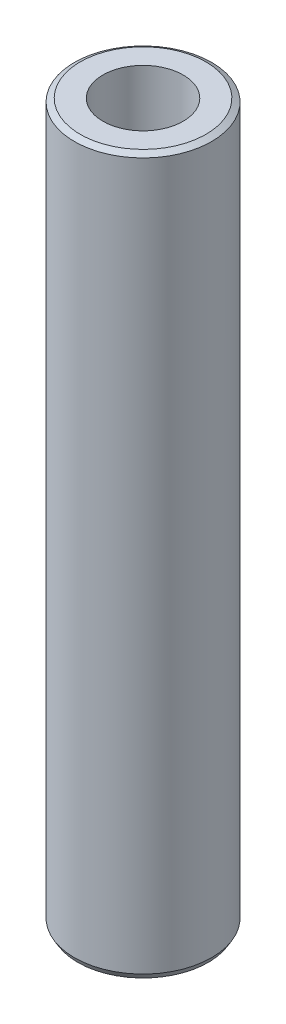
ISO-10303-21;
HEADER;
FILE_DESCRIPTION(('STEP AP214'),'2;1');
FILE_NAME('part.step','',(''),(''),'','','');
FILE_SCHEMA(('AUTOMOTIVE_DESIGN { 1 0 10303 214 1 1 1 1 }'));
ENDSEC;
DATA;
#1=APPLICATION_CONTEXT('core data for automotive mechanical design processes');
#2=APPLICATION_PROTOCOL_DEFINITION('international standard','automotive_design',2000,#1);
#3=PRODUCT_CONTEXT('',#1,'mechanical');
#4=PRODUCT('Part','Part','',(#3));
#5=PRODUCT_RELATED_PRODUCT_CATEGORY('part','',(#4));
#6=PRODUCT_DEFINITION_FORMATION('','',#4);
#7=PRODUCT_DEFINITION_CONTEXT('part definition',#1,'design');
#8=PRODUCT_DEFINITION('design','',#6,#7);
#9=PRODUCT_DEFINITION_SHAPE('','',#8);
#10=(LENGTH_UNIT() NAMED_UNIT(*) SI_UNIT(.MILLI.,.METRE.));
#11=(NAMED_UNIT(*) PLANE_ANGLE_UNIT() SI_UNIT($,.RADIAN.));
#12=(NAMED_UNIT(*) SI_UNIT($,.STERADIAN.) SOLID_ANGLE_UNIT());
#13=UNCERTAINTY_MEASURE_WITH_UNIT(LENGTH_MEASURE(1.E-05),#10,'distance_accuracy_value','');
#14=(GEOMETRIC_REPRESENTATION_CONTEXT(3) GLOBAL_UNCERTAINTY_ASSIGNED_CONTEXT((#13)) GLOBAL_UNIT_ASSIGNED_CONTEXT((#10,
#11,#12)) REPRESENTATION_CONTEXT('',''));
#15=CARTESIAN_POINT('',(0.,0.,0.));
#16=DIRECTION('',(0.,0.,1.));
#17=DIRECTION('',(1.,0.,0.));
#18=AXIS2_PLACEMENT_3D('',#15,#16,#17);
#19=CARTESIAN_POINT('',(0.,600.,0.));
#20=DIRECTION('',(0.,-1.,0.));
#21=DIRECTION('',(0.,0.,-1.));
#22=AXIS2_PLACEMENT_3D('',#19,#20,#21);
#23=CYLINDRICAL_SURFACE('',#22,57.5);
#24=CARTESIAN_POINT('',(0.,597.20780532092,0.));
#25=DIRECTION('',(0.,1.,0.));
#26=DIRECTION('',(0.,0.,1.));
#27=AXIS2_PLACEMENT_3D('',#24,#25,#26);
#28=CIRCLE('',#27,57.5);
#29=CARTESIAN_POINT('',(0.,597.207805320919,-57.5000000000001));
#30=VERTEX_POINT('',#29);
#31=EDGE_CURVE('E50',#30,#30,#28,.F.);
#32=ORIENTED_EDGE('',*,*,#31,.T.);
#33=EDGE_LOOP('',(#32));
#34=FACE_BOUND('',#33,.T.);
#35=CARTESIAN_POINT('',(0.,4.83622304879094,0.));
#36=DIRECTION('',(0.,1.,0.));
#37=DIRECTION('',(0.,0.,1.));
#38=AXIS2_PLACEMENT_3D('',#35,#36,#37);
#39=CIRCLE('',#38,57.5);
#40=CARTESIAN_POINT('',(0.,4.83622304879094,57.5));
#41=VERTEX_POINT('',#40);
#42=EDGE_CURVE('E51',#41,#41,#39,.T.);
#43=ORIENTED_EDGE('',*,*,#42,.T.);
#44=EDGE_LOOP('',(#43));
#45=FACE_BOUND('',#44,.T.);
#46=ADVANCED_FACE('F39',(#34,#45),#23,.T.);
#47=CARTESIAN_POINT('',(0.,600.,0.));
#48=DIRECTION('',(0.,1.,0.));
#49=DIRECTION('',(0.,0.,1.));
#50=AXIS2_PLACEMENT_3D('',#47,#48,#49);
#51=PLANE('',#50);
#52=CARTESIAN_POINT('',(0.,600.,0.));
#53=DIRECTION('',(0.,1.,0.));
#54=DIRECTION('',(0.,0.,1.));
#55=AXIS2_PLACEMENT_3D('',#52,#53,#54);
#56=CIRCLE('',#55,52.6637769512092);
#57=CARTESIAN_POINT('',(0.,600.,-52.6637769512093));
#58=VERTEX_POINT('',#57);
#59=EDGE_CURVE('E54',#58,#58,#56,.T.);
#60=ORIENTED_EDGE('',*,*,#59,.T.);
#61=EDGE_LOOP('',(#60));
#62=FACE_BOUND('',#61,.T.);
#63=CARTESIAN_POINT('',(0.,600.,0.));
#64=DIRECTION('',(0.,1.,0.));
#65=DIRECTION('',(0.,0.,1.));
#66=AXIS2_PLACEMENT_3D('',#63,#64,#65);
#67=CIRCLE('',#66,33.6478027003522);
#68=CARTESIAN_POINT('',(0.,600.,33.6478027003522));
#69=VERTEX_POINT('',#68);
#70=EDGE_CURVE('E58',#69,#69,#67,.T.);
#71=ORIENTED_EDGE('',*,*,#70,.F.);
#72=EDGE_LOOP('',(#71));
#73=FACE_BOUND('',#72,.T.);
#74=ADVANCED_FACE('F69',(#62,#73),#51,.T.);
#75=CARTESIAN_POINT('',(0.,0.,0.));
#76=DIRECTION('',(0.,1.,0.));
#77=DIRECTION('',(0.,0.,1.));
#78=AXIS2_PLACEMENT_3D('',#75,#76,#77);
#79=PLANE('',#78);
#80=CARTESIAN_POINT('',(0.,0.,0.));
#81=DIRECTION('',(0.,1.,0.));
#82=DIRECTION('',(0.,0.,1.));
#83=AXIS2_PLACEMENT_3D('',#80,#81,#82);
#84=CIRCLE('',#83,54.7078053209195);
#85=CARTESIAN_POINT('',(0.,0.,54.7078053209195));
#86=VERTEX_POINT('',#85);
#87=EDGE_CURVE('E10',#86,#86,#84,.F.);
#88=ORIENTED_EDGE('',*,*,#87,.T.);
#89=EDGE_LOOP('',(#88));
#90=FACE_BOUND('',#89,.T.);
#91=CARTESIAN_POINT('',(0.,0.,0.));
#92=DIRECTION('',(0.,1.,0.));
#93=DIRECTION('',(0.,0.,1.));
#94=AXIS2_PLACEMENT_3D('',#91,#92,#93);
#95=CIRCLE('',#94,33.6478027003522);
#96=CARTESIAN_POINT('',(0.,0.,33.6478027003522));
#97=VERTEX_POINT('',#96);
#98=EDGE_CURVE('E63',#97,#97,#95,.T.);
#99=ORIENTED_EDGE('',*,*,#98,.T.);
#100=EDGE_LOOP('',(#99));
#101=FACE_BOUND('',#100,.T.);
#102=ADVANCED_FACE('F75',(#90,#101),#79,.F.);
#103=CARTESIAN_POINT('',(0.,600.,0.));
#104=DIRECTION('',(0.,-1.,0.));
#105=DIRECTION('',(0.,0.,-1.));
#106=AXIS2_PLACEMENT_3D('',#103,#104,#105);
#107=CYLINDRICAL_SURFACE('',#106,33.6478027003522);
#108=ORIENTED_EDGE('',*,*,#70,.T.);
#109=EDGE_LOOP('',(#108));
#110=FACE_BOUND('',#109,.T.);
#111=ORIENTED_EDGE('',*,*,#98,.F.);
#112=EDGE_LOOP('',(#111));
#113=FACE_BOUND('',#112,.T.);
#114=ADVANCED_FACE('F70',(#110,#113),#107,.F.);
#115=CARTESIAN_POINT('',(0.,600.,0.));
#116=DIRECTION('',(0.,-1.,0.));
#117=DIRECTION('',(0.,0.,-1.));
#118=AXIS2_PLACEMENT_3D('',#115,#116,#117);
#119=CONICAL_SURFACE('',#118,52.6637769512092,1.0471975511966);
#120=CARTESIAN_POINT('',(0.,597.207805320919,-57.5000000000001));
#121=CARTESIAN_POINT('',(0.,597.23689068216,-57.4496226765752));
#122=CARTESIAN_POINT('',(0.,597.2659760434,-57.3992453531503));
#123=CARTESIAN_POINT('',(0.,597.324146765881,-57.2984907063005));
#124=CARTESIAN_POINT('',(0.,597.353232127122,-57.2481133828756));
#125=CARTESIAN_POINT('',(0.,597.411402849602,-57.1473587360258));
#126=CARTESIAN_POINT('',(0.,597.440488210843,-57.0969814126009));
#127=CARTESIAN_POINT('',(0.,597.498658933324,-56.9962267657511));
#128=CARTESIAN_POINT('',(0.,597.527744294564,-56.9458494423262));
#129=CARTESIAN_POINT('',(0.,597.585915017045,-56.8450947954763));
#130=CARTESIAN_POINT('',(0.,597.615000378285,-56.7947174720514));
#131=CARTESIAN_POINT('',(0.,597.673171100766,-56.6939628252016));
#132=CARTESIAN_POINT('',(0.,597.702256462007,-56.6435855017767));
#133=CARTESIAN_POINT('',(0.,597.760427184488,-56.5428308549269));
#134=CARTESIAN_POINT('',(0.,597.789512545728,-56.492453531502));
#135=CARTESIAN_POINT('',(0.,597.847683268209,-56.3916988846522));
#136=CARTESIAN_POINT('',(0.,597.876768629449,-56.3413215612273));
#137=CARTESIAN_POINT('',(0.,597.93493935193,-56.2405669143775));
#138=CARTESIAN_POINT('',(0.,597.96402471317,-56.1901895909526));
#139=CARTESIAN_POINT('',(0.,598.022195435651,-56.0894349441028));
#140=CARTESIAN_POINT('',(0.,598.051280796892,-56.0390576206779));
#141=CARTESIAN_POINT('',(0.,598.109451519373,-55.9383029738281));
#142=CARTESIAN_POINT('',(0.,598.138536880613,-55.8879256504032));
#143=CARTESIAN_POINT('',(0.,598.196707603094,-55.7871710035533));
#144=CARTESIAN_POINT('',(0.,598.225792964334,-55.7367936801284));
#145=CARTESIAN_POINT('',(0.,598.283963686815,-55.6360390332786));
#146=CARTESIAN_POINT('',(0.,598.313049048056,-55.5856617098537));
#147=CARTESIAN_POINT('',(0.,598.371219770536,-55.4849070630039));
#148=CARTESIAN_POINT('',(0.,598.400305131777,-55.434529739579));
#149=CARTESIAN_POINT('',(0.,598.458475854258,-55.3337750927292));
#150=CARTESIAN_POINT('',(0.,598.487561215498,-55.2833977693043));
#151=CARTESIAN_POINT('',(0.,598.545731937979,-55.1826431224545));
#152=CARTESIAN_POINT('',(0.,598.574817299219,-55.1322657990296));
#153=CARTESIAN_POINT('',(0.,598.6329880217,-55.0315111521798));
#154=CARTESIAN_POINT('',(0.,598.662073382941,-54.9811338287549));
#155=CARTESIAN_POINT('',(0.,598.720244105421,-54.8803791819051));
#156=CARTESIAN_POINT('',(0.,598.749329466662,-54.8300018584802));
#157=CARTESIAN_POINT('',(0.,598.807500189143,-54.7292472116303));
#158=CARTESIAN_POINT('',(0.,598.836585550383,-54.6788698882054));
#159=CARTESIAN_POINT('',(0.,598.894756272864,-54.5781152413556));
#160=CARTESIAN_POINT('',(0.,598.923841634104,-54.5277379179307));
#161=CARTESIAN_POINT('',(0.,598.982012356585,-54.4269832710809));
#162=CARTESIAN_POINT('',(0.,599.011097717826,-54.376605947656));
#163=CARTESIAN_POINT('',(0.,599.069268440306,-54.2758513008062));
#164=CARTESIAN_POINT('',(0.,599.098353801547,-54.2254739773813));
#165=CARTESIAN_POINT('',(0.,599.156524524028,-54.1247193305315));
#166=CARTESIAN_POINT('',(0.,599.185609885268,-54.0743420071066));
#167=CARTESIAN_POINT('',(0.,599.243780607749,-53.9735873602568));
#168=CARTESIAN_POINT('',(0.,599.272865968989,-53.9232100368319));
#169=CARTESIAN_POINT('',(0.,599.33103669147,-53.8224553899821));
#170=CARTESIAN_POINT('',(0.,599.360122052711,-53.7720780665572));
#171=CARTESIAN_POINT('',(0.,599.418292775192,-53.6713234197073));
#172=CARTESIAN_POINT('',(0.,599.447378136432,-53.6209460962824));
#173=CARTESIAN_POINT('',(0.,599.505548858913,-53.5201914494326));
#174=CARTESIAN_POINT('',(0.,599.534634220153,-53.4698141260077));
#175=CARTESIAN_POINT('',(0.,599.592804942634,-53.3690594791579));
#176=CARTESIAN_POINT('',(0.,599.621890303874,-53.318682155733));
#177=CARTESIAN_POINT('',(0.,599.680061026355,-53.2179275088832));
#178=CARTESIAN_POINT('',(0.,599.709146387596,-53.1675501854583));
#179=CARTESIAN_POINT('',(0.,599.767317110077,-53.0667955386085));
#180=CARTESIAN_POINT('',(0.,599.796402471317,-53.0164182151836));
#181=CARTESIAN_POINT('',(0.,599.854573193798,-52.9156635683338));
#182=CARTESIAN_POINT('',(0.,599.883658555038,-52.8652862449089));
#183=CARTESIAN_POINT('',(0.,599.941829277519,-52.7645315980591));
#184=CARTESIAN_POINT('',(0.,599.970914638759,-52.7141542746342));
#185=CARTESIAN_POINT('',(0.,600.,-52.6637769512093));
#186=B_SPLINE_CURVE_WITH_KNOTS('',3,(#120,#121,#122,#123,#124,#125,#126,#127,#128,#129,#130,
#131,#132,#133,#134,#135,#136,#137,#138,#139,#140,#141,#142,#143,#144,#145,#146,#147,#148,#149,
#150,#151,#152,#153,#154,#155,#156,#157,#158,#159,#160,#161,#162,#163,#164,#165,#166,#167,#168,
#169,#170,#171,#172,#173,#174,#175,#176,#177,#178,#179,#180,#181,#182,#183,#184,#185),
.UNSPECIFIED.,.F.,.F.,(4,2,2,2,2,2,2,2,2,2,2,2,2,2,2,2,2,2,2,2,2,2,2,2,2,2,2,2,2,2,2,2,4),(0.,
0.17451216744254,0.349024334885081,0.523536502327621,0.698048669770162,0.872560837212647,
1.04707300465519,1.22158517209773,1.39609733954027,1.57060950698281,1.74512167442529,
1.91963384186783,2.09414600931037,2.26865817675291,2.4431703441954,2.61768251163794,
2.79219467908049,2.96670684652303,3.14121901396557,3.31573118140805,3.49024334885059,
3.66475551629313,3.83926768373567,4.01377985117816,4.1882920186207,4.36280418606324,
4.53731635350578,4.71182852094832,4.8863406883908,5.06085285583334,5.23536502327589,
5.40987719071843,5.58438935816097),.UNSPECIFIED.);
#187=EDGE_CURVE('BSEAM81',#30,#58,#186,.T.);
#188=ORIENTED_EDGE('',*,*,#31,.F.);
#189=ORIENTED_EDGE('',*,*,#59,.F.);
#190=ORIENTED_EDGE('',*,*,#187,.T.);
#191=ORIENTED_EDGE('',*,*,#187,.F.);
#192=EDGE_LOOP('',(#188,#190,#189,#191));
#193=FACE_BOUND('',#192,.T.);
#194=ADVANCED_FACE('F81',(#193),#119,.T.);
#195=CARTESIAN_POINT('',(0.,4.83622304879094,0.));
#196=DIRECTION('',(0.,1.,0.));
#197=DIRECTION('',(0.,0.,1.));
#198=AXIS2_PLACEMENT_3D('',#195,#196,#197);
#199=CONICAL_SURFACE('',#198,57.5,0.523598775598302);
#200=ORIENTED_EDGE('',*,*,#87,.F.);
#201=EDGE_LOOP('',(#200));
#202=FACE_BOUND('',#201,.T.);
#203=ORIENTED_EDGE('',*,*,#42,.F.);
#204=EDGE_LOOP('',(#203));
#205=FACE_BOUND('',#204,.T.);
#206=ADVANCED_FACE('F45',(#202,#205),#199,.T.);
#207=CLOSED_SHELL('',(#46,#74,#102,#114,#194,#206));
#208=MANIFOLD_SOLID_BREP('B2',#207);
#209=ADVANCED_BREP_SHAPE_REPRESENTATION('',(#18,#208),#14);
#210=SHAPE_DEFINITION_REPRESENTATION(#9,#209);
ENDSEC;
END-ISO-10303-21;
